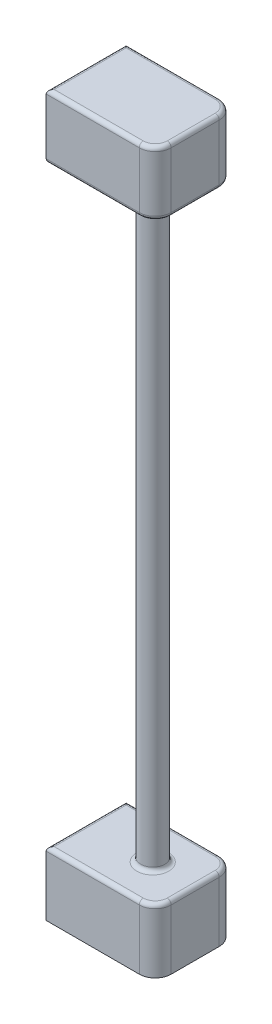
ISO-10303-21;
HEADER;
FILE_DESCRIPTION(('STEP AP214'),'2;1');
FILE_NAME('part.step','',(''),(''),'','','');
FILE_SCHEMA(('AUTOMOTIVE_DESIGN { 1 0 10303 214 1 1 1 1 }'));
ENDSEC;
DATA;
#1=APPLICATION_CONTEXT('core data for automotive mechanical design processes');
#2=APPLICATION_PROTOCOL_DEFINITION('international standard','automotive_design',2000,#1);
#3=PRODUCT_CONTEXT('',#1,'mechanical');
#4=PRODUCT('Part','Part','',(#3));
#5=PRODUCT_RELATED_PRODUCT_CATEGORY('part','',(#4));
#6=PRODUCT_DEFINITION_FORMATION('','',#4);
#7=PRODUCT_DEFINITION_CONTEXT('part definition',#1,'design');
#8=PRODUCT_DEFINITION('design','',#6,#7);
#9=PRODUCT_DEFINITION_SHAPE('','',#8);
#10=(LENGTH_UNIT() NAMED_UNIT(*) SI_UNIT(.MILLI.,.METRE.));
#11=(NAMED_UNIT(*) PLANE_ANGLE_UNIT() SI_UNIT($,.RADIAN.));
#12=(NAMED_UNIT(*) SI_UNIT($,.STERADIAN.) SOLID_ANGLE_UNIT());
#13=UNCERTAINTY_MEASURE_WITH_UNIT(LENGTH_MEASURE(1.E-05),#10,'distance_accuracy_value','');
#14=(GEOMETRIC_REPRESENTATION_CONTEXT(3) GLOBAL_UNCERTAINTY_ASSIGNED_CONTEXT((#13)) GLOBAL_UNIT_ASSIGNED_CONTEXT((#10,
#11,#12)) REPRESENTATION_CONTEXT('',''));
#15=CARTESIAN_POINT('',(0.,0.,0.));
#16=DIRECTION('',(0.,0.,1.));
#17=DIRECTION('',(1.,0.,0.));
#18=AXIS2_PLACEMENT_3D('',#15,#16,#17);
#19=CARTESIAN_POINT('',(0.,0.,0.));
#20=DIRECTION('',(0.,-1.,0.));
#21=DIRECTION('',(0.,0.,-1.));
#22=AXIS2_PLACEMENT_3D('',#19,#20,#21);
#23=CYLINDRICAL_SURFACE('',#22,7.5);
#24=CARTESIAN_POINT('',(0.,42.5,0.));
#25=DIRECTION('',(0.,-1.,0.));
#26=DIRECTION('',(0.,0.,-1.));
#27=AXIS2_PLACEMENT_3D('',#24,#25,#26);
#28=CIRCLE('',#27,7.5);
#29=CARTESIAN_POINT('',(0.,42.5,-7.5));
#30=VERTEX_POINT('',#29);
#31=EDGE_CURVE('E293',#30,#30,#28,.F.);
#32=ORIENTED_EDGE('',*,*,#31,.T.);
#33=EDGE_LOOP('',(#32));
#34=FACE_BOUND('',#33,.T.);
#35=CARTESIAN_POINT('',(0.,407.5,0.));
#36=DIRECTION('',(0.,1.,0.));
#37=DIRECTION('',(0.,0.,1.));
#38=AXIS2_PLACEMENT_3D('',#35,#36,#37);
#39=CIRCLE('',#38,7.5);
#40=CARTESIAN_POINT('',(0.,407.5,7.5));
#41=VERTEX_POINT('',#40);
#42=EDGE_CURVE('E277',#41,#41,#39,.F.);
#43=ORIENTED_EDGE('',*,*,#42,.T.);
#44=EDGE_LOOP('',(#43));
#45=FACE_BOUND('',#44,.T.);
#46=ADVANCED_FACE('F32',(#34,#45),#23,.T.);
#47=CARTESIAN_POINT('',(-41.6342119381749,410.,25.));
#48=DIRECTION('',(-1.,0.,0.));
#49=DIRECTION('',(0.,0.,1.));
#50=AXIS2_PLACEMENT_3D('',#47,#48,#49);
#51=PLANE('',#50);
#52=DIRECTION('',(0.,1.,0.));
#53=VECTOR('',#52,1.);
#54=CARTESIAN_POINT('',(-41.6342119381749,410.,-25.));
#55=LINE('',#54,#53);
#56=CARTESIAN_POINT('',(-41.6342119381749,412.5,-25.));
#57=VERTEX_POINT('',#56);
#58=CARTESIAN_POINT('',(-41.6342119381749,447.5,-25.));
#59=VERTEX_POINT('',#58);
#60=EDGE_CURVE('E220',#57,#59,#55,.T.);
#61=ORIENTED_EDGE('',*,*,#60,.F.);
#62=DIRECTION('',(0.,0.,1.));
#63=VECTOR('',#62,1.);
#64=CARTESIAN_POINT('',(-41.6342119381749,412.5,25.));
#65=LINE('',#64,#63);
#66=CARTESIAN_POINT('',(-41.6342119381749,412.5,25.));
#67=VERTEX_POINT('',#66);
#68=EDGE_CURVE('E271',#57,#67,#65,.T.);
#69=ORIENTED_EDGE('',*,*,#68,.T.);
#70=DIRECTION('',(0.,1.,0.));
#71=VECTOR('',#70,1.);
#72=CARTESIAN_POINT('',(-41.6342119381749,410.,25.));
#73=LINE('',#72,#71);
#74=CARTESIAN_POINT('',(-41.6342119381749,447.5,25.));
#75=VERTEX_POINT('',#74);
#76=EDGE_CURVE('E216',#67,#75,#73,.T.);
#77=ORIENTED_EDGE('',*,*,#76,.T.);
#78=DIRECTION('',(0.,0.,1.));
#79=VECTOR('',#78,1.);
#80=CARTESIAN_POINT('',(-41.6342119381749,447.5,25.));
#81=LINE('',#80,#79);
#82=EDGE_CURVE('E269',#75,#59,#81,.F.);
#83=ORIENTED_EDGE('',*,*,#82,.T.);
#84=EDGE_LOOP('',(#61,#69,#77,#83));
#85=FACE_BOUND('',#84,.T.);
#86=ADVANCED_FACE('F406',(#85),#51,.T.);
#87=CARTESIAN_POINT('',(-31.7477646685832,410.,-25.));
#88=DIRECTION('',(0.,0.,-1.));
#89=DIRECTION('',(-1.,0.,0.));
#90=AXIS2_PLACEMENT_3D('',#87,#88,#89);
#91=PLANE('',#90);
#92=DIRECTION('',(0.,1.,0.));
#93=VECTOR('',#92,1.);
#94=CARTESIAN_POINT('',(16.5523568564973,410.,-25.));
#95=LINE('',#94,#93);
#96=CARTESIAN_POINT('',(16.5523568564973,412.5,-25.));
#97=VERTEX_POINT('',#96);
#98=CARTESIAN_POINT('',(16.5523568564973,447.5,-25.));
#99=VERTEX_POINT('',#98);
#100=EDGE_CURVE('E223',#97,#99,#95,.T.);
#101=ORIENTED_EDGE('',*,*,#100,.F.);
#102=DIRECTION('',(-1.,0.,0.));
#103=VECTOR('',#102,1.);
#104=CARTESIAN_POINT('',(-41.6342119381749,412.5,-25.));
#105=LINE('',#104,#103);
#106=EDGE_CURVE('E267',#97,#57,#105,.T.);
#107=ORIENTED_EDGE('',*,*,#106,.T.);
#108=ORIENTED_EDGE('',*,*,#60,.T.);
#109=DIRECTION('',(-1.,0.,0.));
#110=VECTOR('',#109,1.);
#111=CARTESIAN_POINT('',(-31.7477646685832,447.5,-25.));
#112=LINE('',#111,#110);
#113=EDGE_CURVE('E264',#59,#99,#112,.F.);
#114=ORIENTED_EDGE('',*,*,#113,.T.);
#115=EDGE_LOOP('',(#101,#107,#108,#114));
#116=FACE_BOUND('',#115,.T.);
#117=ADVANCED_FACE('F412',(#116),#91,.T.);
#118=CARTESIAN_POINT('',(16.5523568564973,410.,-15.));
#119=DIRECTION('',(0.,1.,0.));
#120=DIRECTION('',(0.,0.,1.));
#121=AXIS2_PLACEMENT_3D('',#118,#119,#120);
#122=CYLINDRICAL_SURFACE('',#121,10.);
#123=DIRECTION('',(0.,1.,0.));
#124=VECTOR('',#123,1.);
#125=CARTESIAN_POINT('',(26.5523568564973,410.,-14.9999999999999));
#126=LINE('',#125,#124);
#127=CARTESIAN_POINT('',(26.5523568564973,412.5,-14.9999999999999));
#128=VERTEX_POINT('',#127);
#129=CARTESIAN_POINT('',(26.5523568564973,447.5,-14.9999999999999));
#130=VERTEX_POINT('',#129);
#131=EDGE_CURVE('E226',#128,#130,#126,.T.);
#132=ORIENTED_EDGE('',*,*,#131,.F.);
#133=CARTESIAN_POINT('',(16.5523568564973,412.5,-15.));
#134=DIRECTION('',(0.,1.,0.));
#135=DIRECTION('',(0.,0.,1.));
#136=AXIS2_PLACEMENT_3D('',#133,#134,#135);
#137=CIRCLE('',#136,10.);
#138=EDGE_CURVE('E262',#128,#97,#137,.T.);
#139=ORIENTED_EDGE('',*,*,#138,.T.);
#140=ORIENTED_EDGE('',*,*,#100,.T.);
#141=CARTESIAN_POINT('',(16.5523568564973,447.5,-15.));
#142=DIRECTION('',(0.,1.,0.));
#143=DIRECTION('',(0.,0.,1.));
#144=AXIS2_PLACEMENT_3D('',#141,#142,#143);
#145=CIRCLE('',#144,10.);
#146=EDGE_CURVE('E260',#99,#130,#145,.F.);
#147=ORIENTED_EDGE('',*,*,#146,.T.);
#148=EDGE_LOOP('',(#132,#139,#140,#147));
#149=FACE_BOUND('',#148,.T.);
#150=ADVANCED_FACE('F681',(#149),#122,.T.);
#151=CARTESIAN_POINT('',(26.5523568564973,410.,-14.9999999999999));
#152=DIRECTION('',(1.,0.,0.));
#153=DIRECTION('',(0.,0.,-1.));
#154=AXIS2_PLACEMENT_3D('',#151,#152,#153);
#155=PLANE('',#154);
#156=DIRECTION('',(0.,1.,0.));
#157=VECTOR('',#156,1.);
#158=CARTESIAN_POINT('',(26.5523568564973,410.,14.9999999999999));
#159=LINE('',#158,#157);
#160=CARTESIAN_POINT('',(26.5523568564973,412.5,14.9999999999999));
#161=VERTEX_POINT('',#160);
#162=CARTESIAN_POINT('',(26.5523568564973,447.5,14.9999999999999));
#163=VERTEX_POINT('',#162);
#164=EDGE_CURVE('E229',#161,#163,#159,.T.);
#165=ORIENTED_EDGE('',*,*,#164,.F.);
#166=DIRECTION('',(0.,0.,-1.));
#167=VECTOR('',#166,1.);
#168=CARTESIAN_POINT('',(26.5523568564973,412.5,-14.9999999999999));
#169=LINE('',#168,#167);
#170=EDGE_CURVE('E258',#161,#128,#169,.T.);
#171=ORIENTED_EDGE('',*,*,#170,.T.);
#172=ORIENTED_EDGE('',*,*,#131,.T.);
#173=DIRECTION('',(0.,0.,-1.));
#174=VECTOR('',#173,1.);
#175=CARTESIAN_POINT('',(26.5523568564973,447.5,-14.9999999999999));
#176=LINE('',#175,#174);
#177=EDGE_CURVE('E256',#130,#163,#176,.F.);
#178=ORIENTED_EDGE('',*,*,#177,.T.);
#179=EDGE_LOOP('',(#165,#171,#172,#178));
#180=FACE_BOUND('',#179,.T.);
#181=ADVANCED_FACE('F671',(#180),#155,.T.);
#182=CARTESIAN_POINT('',(16.5523568564973,410.,15.));
#183=DIRECTION('',(0.,1.,0.));
#184=DIRECTION('',(0.,0.,1.));
#185=AXIS2_PLACEMENT_3D('',#182,#183,#184);
#186=CYLINDRICAL_SURFACE('',#185,10.);
#187=DIRECTION('',(0.,1.,0.));
#188=VECTOR('',#187,1.);
#189=CARTESIAN_POINT('',(16.5523568564973,410.,25.));
#190=LINE('',#189,#188);
#191=CARTESIAN_POINT('',(16.5523568564973,412.5,25.));
#192=VERTEX_POINT('',#191);
#193=CARTESIAN_POINT('',(16.5523568564973,447.5,25.));
#194=VERTEX_POINT('',#193);
#195=EDGE_CURVE('E232',#192,#194,#190,.T.);
#196=ORIENTED_EDGE('',*,*,#195,.F.);
#197=CARTESIAN_POINT('',(16.5523568564973,412.5,15.));
#198=DIRECTION('',(0.,1.,0.));
#199=DIRECTION('',(0.,0.,1.));
#200=AXIS2_PLACEMENT_3D('',#197,#198,#199);
#201=CIRCLE('',#200,10.);
#202=EDGE_CURVE('E237',#192,#161,#201,.T.);
#203=ORIENTED_EDGE('',*,*,#202,.T.);
#204=ORIENTED_EDGE('',*,*,#164,.T.);
#205=CARTESIAN_POINT('',(16.5523568564973,447.5,15.));
#206=DIRECTION('',(0.,1.,0.));
#207=DIRECTION('',(0.,0.,1.));
#208=AXIS2_PLACEMENT_3D('',#205,#206,#207);
#209=CIRCLE('',#208,10.);
#210=EDGE_CURVE('E219',#163,#194,#209,.F.);
#211=ORIENTED_EDGE('',*,*,#210,.T.);
#212=EDGE_LOOP('',(#196,#203,#204,#211));
#213=FACE_BOUND('',#212,.T.);
#214=ADVANCED_FACE('F661',(#213),#186,.T.);
#215=CARTESIAN_POINT('',(-31.7477646685832,410.,25.));
#216=DIRECTION('',(0.,0.,1.));
#217=DIRECTION('',(1.,0.,0.));
#218=AXIS2_PLACEMENT_3D('',#215,#216,#217);
#219=PLANE('',#218);
#220=ORIENTED_EDGE('',*,*,#76,.F.);
#221=DIRECTION('',(1.,0.,0.));
#222=VECTOR('',#221,1.);
#223=CARTESIAN_POINT('',(16.5523568564973,412.5,25.));
#224=LINE('',#223,#222);
#225=EDGE_CURVE('E275',#67,#192,#224,.T.);
#226=ORIENTED_EDGE('',*,*,#225,.T.);
#227=ORIENTED_EDGE('',*,*,#195,.T.);
#228=DIRECTION('',(1.,0.,0.));
#229=VECTOR('',#228,1.);
#230=CARTESIAN_POINT('',(-31.7477646685832,447.5,25.));
#231=LINE('',#230,#229);
#232=EDGE_CURVE('E273',#194,#75,#231,.F.);
#233=ORIENTED_EDGE('',*,*,#232,.T.);
#234=EDGE_LOOP('',(#220,#226,#227,#233));
#235=FACE_BOUND('',#234,.T.);
#236=ADVANCED_FACE('F651',(#235),#219,.T.);
#237=CARTESIAN_POINT('',(16.5523568564973,410.,-15.));
#238=DIRECTION('',(0.,1.,0.));
#239=DIRECTION('',(0.,0.,1.));
#240=AXIS2_PLACEMENT_3D('',#237,#238,#239);
#241=PLANE('',#240);
#242=DIRECTION('',(0.,0.,-1.));
#243=VECTOR('',#242,1.);
#244=CARTESIAN_POINT('',(24.0523568564973,410.,14.9999999999999));
#245=LINE('',#244,#243);
#246=CARTESIAN_POINT('',(24.0523568564973,410.,-14.9999999999999));
#247=VERTEX_POINT('',#246);
#248=CARTESIAN_POINT('',(24.0523568564973,410.,14.9999999999999));
#249=VERTEX_POINT('',#248);
#250=EDGE_CURVE('E251',#247,#249,#245,.F.);
#251=ORIENTED_EDGE('',*,*,#250,.T.);
#252=CARTESIAN_POINT('',(16.5523568564973,410.,15.));
#253=DIRECTION('',(0.,1.,0.));
#254=DIRECTION('',(0.,0.,1.));
#255=AXIS2_PLACEMENT_3D('',#252,#253,#254);
#256=CIRCLE('',#255,7.5);
#257=CARTESIAN_POINT('',(16.5523568564973,410.,22.5));
#258=VERTEX_POINT('',#257);
#259=EDGE_CURVE('E253',#249,#258,#256,.F.);
#260=ORIENTED_EDGE('',*,*,#259,.T.);
#261=DIRECTION('',(1.,0.,0.));
#262=VECTOR('',#261,1.);
#263=CARTESIAN_POINT('',(-41.6342119381749,410.,22.5));
#264=LINE('',#263,#262);
#265=CARTESIAN_POINT('',(-39.1342119381748,410.,22.5));
#266=VERTEX_POINT('',#265);
#267=EDGE_CURVE('E243',#258,#266,#264,.F.);
#268=ORIENTED_EDGE('',*,*,#267,.T.);
#269=DIRECTION('',(0.,0.,1.));
#270=VECTOR('',#269,1.);
#271=CARTESIAN_POINT('',(-39.1342119381748,410.,-25.));
#272=LINE('',#271,#270);
#273=CARTESIAN_POINT('',(-39.1342119381748,410.,-22.5));
#274=VERTEX_POINT('',#273);
#275=EDGE_CURVE('E245',#266,#274,#272,.F.);
#276=ORIENTED_EDGE('',*,*,#275,.T.);
#277=DIRECTION('',(-1.,0.,0.));
#278=VECTOR('',#277,1.);
#279=CARTESIAN_POINT('',(16.5523568564973,410.,-22.5));
#280=LINE('',#279,#278);
#281=CARTESIAN_POINT('',(16.5523568564973,410.,-22.5));
#282=VERTEX_POINT('',#281);
#283=EDGE_CURVE('E247',#274,#282,#280,.F.);
#284=ORIENTED_EDGE('',*,*,#283,.T.);
#285=CARTESIAN_POINT('',(16.5523568564973,410.,-15.));
#286=DIRECTION('',(0.,1.,0.));
#287=DIRECTION('',(0.,0.,1.));
#288=AXIS2_PLACEMENT_3D('',#285,#286,#287);
#289=CIRCLE('',#288,7.5);
#290=EDGE_CURVE('E249',#282,#247,#289,.F.);
#291=ORIENTED_EDGE('',*,*,#290,.T.);
#292=EDGE_LOOP('',(#251,#260,#268,#276,#284,#291));
#293=FACE_BOUND('',#292,.T.);
#294=CARTESIAN_POINT('',(0.,410.,0.));
#295=DIRECTION('',(0.,1.,0.));
#296=DIRECTION('',(0.,0.,1.));
#297=AXIS2_PLACEMENT_3D('',#294,#295,#296);
#298=CIRCLE('',#297,10.);
#299=CARTESIAN_POINT('',(0.,410.,10.));
#300=VERTEX_POINT('',#299);
#301=EDGE_CURVE('E240',#300,#300,#298,.T.);
#302=ORIENTED_EDGE('',*,*,#301,.T.);
#303=EDGE_LOOP('',(#302));
#304=FACE_BOUND('',#303,.T.);
#305=ADVANCED_FACE('F641',(#293,#304),#241,.F.);
#306=CARTESIAN_POINT('',(7.5,450.,0.));
#307=DIRECTION('',(0.,1.,0.));
#308=DIRECTION('',(0.,0.,1.));
#309=AXIS2_PLACEMENT_3D('',#306,#307,#308);
#310=PLANE('',#309);
#311=CARTESIAN_POINT('',(16.5523568564973,450.,-15.));
#312=DIRECTION('',(0.,1.,0.));
#313=DIRECTION('',(0.,0.,1.));
#314=AXIS2_PLACEMENT_3D('',#311,#312,#313);
#315=CIRCLE('',#314,7.5);
#316=CARTESIAN_POINT('',(24.0523568564973,450.,-15.));
#317=VERTEX_POINT('',#316);
#318=CARTESIAN_POINT('',(16.5523568564973,450.,-22.5));
#319=VERTEX_POINT('',#318);
#320=EDGE_CURVE('E288',#317,#319,#315,.T.);
#321=ORIENTED_EDGE('',*,*,#320,.T.);
#322=DIRECTION('',(-1.,0.,0.));
#323=VECTOR('',#322,1.);
#324=CARTESIAN_POINT('',(7.5,450.,-22.5));
#325=LINE('',#324,#323);
#326=CARTESIAN_POINT('',(-39.1342119381748,450.,-22.5));
#327=VERTEX_POINT('',#326);
#328=EDGE_CURVE('E290',#319,#327,#325,.T.);
#329=ORIENTED_EDGE('',*,*,#328,.T.);
#330=DIRECTION('',(0.,0.,1.));
#331=VECTOR('',#330,1.);
#332=CARTESIAN_POINT('',(-39.1342119381748,450.,0.));
#333=LINE('',#332,#331);
#334=CARTESIAN_POINT('',(-39.1342119381748,450.,22.5));
#335=VERTEX_POINT('',#334);
#336=EDGE_CURVE('E280',#327,#335,#333,.T.);
#337=ORIENTED_EDGE('',*,*,#336,.T.);
#338=DIRECTION('',(1.,0.,0.));
#339=VECTOR('',#338,1.);
#340=CARTESIAN_POINT('',(7.5,450.,22.5));
#341=LINE('',#340,#339);
#342=CARTESIAN_POINT('',(16.5523568564973,450.,22.5));
#343=VERTEX_POINT('',#342);
#344=EDGE_CURVE('E282',#335,#343,#341,.T.);
#345=ORIENTED_EDGE('',*,*,#344,.T.);
#346=CARTESIAN_POINT('',(16.5523568564973,450.,15.));
#347=DIRECTION('',(0.,1.,0.));
#348=DIRECTION('',(0.,0.,1.));
#349=AXIS2_PLACEMENT_3D('',#346,#347,#348);
#350=CIRCLE('',#349,7.5);
#351=CARTESIAN_POINT('',(24.0523568564973,450.,14.9999999999999));
#352=VERTEX_POINT('',#351);
#353=EDGE_CURVE('E284',#343,#352,#350,.T.);
#354=ORIENTED_EDGE('',*,*,#353,.T.);
#355=DIRECTION('',(0.,0.,-1.));
#356=VECTOR('',#355,1.);
#357=CARTESIAN_POINT('',(24.0523568564973,450.,0.));
#358=LINE('',#357,#356);
#359=EDGE_CURVE('E286',#352,#317,#358,.T.);
#360=ORIENTED_EDGE('',*,*,#359,.T.);
#361=EDGE_LOOP('',(#321,#329,#337,#345,#354,#360));
#362=FACE_BOUND('',#361,.T.);
#363=ADVANCED_FACE('F418',(#362),#310,.T.);
#364=CARTESIAN_POINT('',(-31.7477646685832,412.5,-22.5));
#365=DIRECTION('',(1.,0.,0.));
#366=DIRECTION('',(0.,0.,-1.));
#367=AXIS2_PLACEMENT_3D('',#364,#365,#366);
#368=CYLINDRICAL_SURFACE('',#367,2.5);
#369=CARTESIAN_POINT('',(16.5523568564973,412.5,-22.5));
#370=DIRECTION('',(1.,0.,0.));
#371=DIRECTION('',(0.,0.,-1.));
#372=AXIS2_PLACEMENT_3D('',#369,#370,#371);
#373=CIRCLE('',#372,2.5);
#374=EDGE_CURVE('E305',#282,#97,#373,.T.);
#375=ORIENTED_EDGE('',*,*,#374,.F.);
#376=ORIENTED_EDGE('',*,*,#283,.F.);
#377=CARTESIAN_POINT('',(-39.1342119381748,412.5,-22.5));
#378=DIRECTION('',(0.707106781186547,0.,-0.707106781186547));
#379=DIRECTION('',(-0.707106781186547,0.,-0.707106781186547));
#380=AXIS2_PLACEMENT_3D('',#377,#378,#379);
#381=ELLIPSE('',#380,3.53553390593274,2.5);
#382=EDGE_CURVE('E235',#57,#274,#381,.F.);
#383=ORIENTED_EDGE('',*,*,#382,.F.);
#384=ORIENTED_EDGE('',*,*,#106,.F.);
#385=EDGE_LOOP('',(#375,#376,#383,#384));
#386=FACE_BOUND('',#385,.T.);
#387=ADVANCED_FACE('F443',(#386),#368,.T.);
#388=CARTESIAN_POINT('',(-39.1342119381748,412.5,25.));
#389=DIRECTION('',(0.,0.,-1.));
#390=DIRECTION('',(-1.,0.,0.));
#391=AXIS2_PLACEMENT_3D('',#388,#389,#390);
#392=CYLINDRICAL_SURFACE('',#391,2.5);
#393=ORIENTED_EDGE('',*,*,#382,.T.);
#394=ORIENTED_EDGE('',*,*,#275,.F.);
#395=CARTESIAN_POINT('',(-39.1342119381748,412.5,22.5));
#396=DIRECTION('',(-0.707106781186547,0.,-0.707106781186547));
#397=DIRECTION('',(-0.707106781186548,0.,0.707106781186547));
#398=AXIS2_PLACEMENT_3D('',#395,#396,#397);
#399=ELLIPSE('',#398,3.53553390593274,2.5);
#400=EDGE_CURVE('E302',#67,#266,#399,.F.);
#401=ORIENTED_EDGE('',*,*,#400,.F.);
#402=ORIENTED_EDGE('',*,*,#68,.F.);
#403=EDGE_LOOP('',(#393,#394,#401,#402));
#404=FACE_BOUND('',#403,.T.);
#405=ADVANCED_FACE('F439',(#404),#392,.T.);
#406=CARTESIAN_POINT('',(16.5523568564973,412.5,-15.));
#407=DIRECTION('',(0.,1.,0.));
#408=DIRECTION('',(0.,0.,1.));
#409=AXIS2_PLACEMENT_3D('',#406,#407,#408);
#410=TOROIDAL_SURFACE('',#409,7.5,2.5);
#411=ORIENTED_EDGE('',*,*,#374,.T.);
#412=ORIENTED_EDGE('',*,*,#138,.F.);
#413=CARTESIAN_POINT('',(24.0523568564973,412.5,-14.9999999999999));
#414=DIRECTION('',(0.,0.,1.));
#415=DIRECTION('',(1.,0.,0.));
#416=AXIS2_PLACEMENT_3D('',#413,#414,#415);
#417=CIRCLE('',#416,2.5);
#418=EDGE_CURVE('E299',#247,#128,#417,.T.);
#419=ORIENTED_EDGE('',*,*,#418,.F.);
#420=ORIENTED_EDGE('',*,*,#290,.F.);
#421=EDGE_LOOP('',(#411,#412,#419,#420));
#422=FACE_BOUND('',#421,.T.);
#423=ADVANCED_FACE('F435',(#422),#410,.T.);
#424=CARTESIAN_POINT('',(-31.7477646685832,412.5,22.5));
#425=DIRECTION('',(-1.,0.,0.));
#426=DIRECTION('',(0.,0.,1.));
#427=AXIS2_PLACEMENT_3D('',#424,#425,#426);
#428=CYLINDRICAL_SURFACE('',#427,2.5);
#429=ORIENTED_EDGE('',*,*,#400,.T.);
#430=ORIENTED_EDGE('',*,*,#267,.F.);
#431=CARTESIAN_POINT('',(16.5523568564973,412.5,22.5));
#432=DIRECTION('',(1.,0.,0.));
#433=DIRECTION('',(0.,1.,0.));
#434=AXIS2_PLACEMENT_3D('',#431,#432,#433);
#435=CIRCLE('',#434,2.5);
#436=EDGE_CURVE('E296',#192,#258,#435,.T.);
#437=ORIENTED_EDGE('',*,*,#436,.F.);
#438=ORIENTED_EDGE('',*,*,#225,.F.);
#439=EDGE_LOOP('',(#429,#430,#437,#438));
#440=FACE_BOUND('',#439,.T.);
#441=ADVANCED_FACE('F431',(#440),#428,.T.);
#442=CARTESIAN_POINT('',(24.0523568564973,412.5,-14.9999999999999));
#443=DIRECTION('',(0.,0.,1.));
#444=DIRECTION('',(1.,0.,0.));
#445=AXIS2_PLACEMENT_3D('',#442,#443,#444);
#446=CYLINDRICAL_SURFACE('',#445,2.5);
#447=ORIENTED_EDGE('',*,*,#418,.T.);
#448=ORIENTED_EDGE('',*,*,#170,.F.);
#449=CARTESIAN_POINT('',(24.0523568564973,412.5,14.9999999999999));
#450=DIRECTION('',(0.,0.,1.));
#451=DIRECTION('',(1.,0.,0.));
#452=AXIS2_PLACEMENT_3D('',#449,#450,#451);
#453=CIRCLE('',#452,2.5);
#454=EDGE_CURVE('E294',#249,#161,#453,.T.);
#455=ORIENTED_EDGE('',*,*,#454,.F.);
#456=ORIENTED_EDGE('',*,*,#250,.F.);
#457=EDGE_LOOP('',(#447,#448,#455,#456));
#458=FACE_BOUND('',#457,.T.);
#459=ADVANCED_FACE('F427',(#458),#446,.T.);
#460=CARTESIAN_POINT('',(16.5523568564973,412.5,15.));
#461=DIRECTION('',(0.,1.,0.));
#462=DIRECTION('',(0.,0.,1.));
#463=AXIS2_PLACEMENT_3D('',#460,#461,#462);
#464=TOROIDAL_SURFACE('',#463,7.5,2.5);
#465=ORIENTED_EDGE('',*,*,#436,.T.);
#466=ORIENTED_EDGE('',*,*,#259,.F.);
#467=ORIENTED_EDGE('',*,*,#454,.T.);
#468=ORIENTED_EDGE('',*,*,#202,.F.);
#469=EDGE_LOOP('',(#465,#466,#467,#468));
#470=FACE_BOUND('',#469,.T.);
#471=ADVANCED_FACE('F423',(#470),#464,.T.);
#472=CARTESIAN_POINT('',(0.,407.5,0.));
#473=DIRECTION('',(0.,1.,0.));
#474=DIRECTION('',(0.,0.,1.));
#475=AXIS2_PLACEMENT_3D('',#472,#473,#474);
#476=TOROIDAL_SURFACE('',#475,10.,2.5);
#477=ORIENTED_EDGE('',*,*,#42,.F.);
#478=EDGE_LOOP('',(#477));
#479=FACE_BOUND('',#478,.T.);
#480=ORIENTED_EDGE('',*,*,#301,.F.);
#481=EDGE_LOOP('',(#480));
#482=FACE_BOUND('',#481,.T.);
#483=ADVANCED_FACE('F426',(#479,#482),#476,.F.);
#484=CARTESIAN_POINT('',(16.5523568564973,447.5,15.));
#485=DIRECTION('',(0.,1.,0.));
#486=DIRECTION('',(0.,0.,1.));
#487=AXIS2_PLACEMENT_3D('',#484,#485,#486);
#488=TOROIDAL_SURFACE('',#487,7.5,2.5);
#489=CARTESIAN_POINT('',(16.5523568564973,447.5,22.5));
#490=DIRECTION('',(-1.,0.,0.));
#491=DIRECTION('',(0.,0.,1.));
#492=AXIS2_PLACEMENT_3D('',#489,#490,#491);
#493=CIRCLE('',#492,2.5);
#494=EDGE_CURVE('E319',#194,#343,#493,.T.);
#495=ORIENTED_EDGE('',*,*,#494,.F.);
#496=ORIENTED_EDGE('',*,*,#210,.F.);
#497=CARTESIAN_POINT('',(24.0523568564973,447.5,14.9999999999999));
#498=DIRECTION('',(0.,0.,-1.));
#499=DIRECTION('',(-1.,0.,0.));
#500=AXIS2_PLACEMENT_3D('',#497,#498,#499);
#501=CIRCLE('',#500,2.5);
#502=EDGE_CURVE('E297',#352,#163,#501,.T.);
#503=ORIENTED_EDGE('',*,*,#502,.F.);
#504=ORIENTED_EDGE('',*,*,#353,.F.);
#505=EDGE_LOOP('',(#495,#496,#503,#504));
#506=FACE_BOUND('',#505,.T.);
#507=ADVANCED_FACE('F450',(#506),#488,.T.);
#508=CARTESIAN_POINT('',(24.0523568564973,447.5,0.));
#509=DIRECTION('',(0.,0.,-1.));
#510=DIRECTION('',(-1.,0.,0.));
#511=AXIS2_PLACEMENT_3D('',#508,#509,#510);
#512=CYLINDRICAL_SURFACE('',#511,2.5);
#513=ORIENTED_EDGE('',*,*,#502,.T.);
#514=ORIENTED_EDGE('',*,*,#177,.F.);
#515=CARTESIAN_POINT('',(24.0523568564973,447.5,-15.));
#516=DIRECTION('',(0.,0.,-1.));
#517=DIRECTION('',(-1.,0.,0.));
#518=AXIS2_PLACEMENT_3D('',#515,#516,#517);
#519=CIRCLE('',#518,2.5);
#520=EDGE_CURVE('E316',#317,#130,#519,.T.);
#521=ORIENTED_EDGE('',*,*,#520,.F.);
#522=ORIENTED_EDGE('',*,*,#359,.F.);
#523=EDGE_LOOP('',(#513,#514,#521,#522));
#524=FACE_BOUND('',#523,.T.);
#525=ADVANCED_FACE('F468',(#524),#512,.T.);
#526=CARTESIAN_POINT('',(7.5,447.5,22.5));
#527=DIRECTION('',(1.,0.,0.));
#528=DIRECTION('',(0.,0.,-1.));
#529=AXIS2_PLACEMENT_3D('',#526,#527,#528);
#530=CYLINDRICAL_SURFACE('',#529,2.5);
#531=ORIENTED_EDGE('',*,*,#494,.T.);
#532=ORIENTED_EDGE('',*,*,#344,.F.);
#533=CARTESIAN_POINT('',(-39.1342119381748,447.5,22.5));
#534=DIRECTION('',(0.707106781186547,0.,0.707106781186547));
#535=DIRECTION('',(-0.707106781186548,0.,0.707106781186547));
#536=AXIS2_PLACEMENT_3D('',#533,#534,#535);
#537=ELLIPSE('',#536,3.53553390593274,2.5);
#538=EDGE_CURVE('E313',#75,#335,#537,.F.);
#539=ORIENTED_EDGE('',*,*,#538,.F.);
#540=ORIENTED_EDGE('',*,*,#232,.F.);
#541=EDGE_LOOP('',(#531,#532,#539,#540));
#542=FACE_BOUND('',#541,.T.);
#543=ADVANCED_FACE('F464',(#542),#530,.T.);
#544=CARTESIAN_POINT('',(16.5523568564973,447.5,-15.));
#545=DIRECTION('',(0.,1.,0.));
#546=DIRECTION('',(0.,0.,1.));
#547=AXIS2_PLACEMENT_3D('',#544,#545,#546);
#548=TOROIDAL_SURFACE('',#547,7.5,2.5);
#549=ORIENTED_EDGE('',*,*,#520,.T.);
#550=ORIENTED_EDGE('',*,*,#146,.F.);
#551=CARTESIAN_POINT('',(16.5523568564973,447.5,-22.5));
#552=DIRECTION('',(-1.,0.,0.));
#553=DIRECTION('',(0.,0.,1.));
#554=AXIS2_PLACEMENT_3D('',#551,#552,#553);
#555=CIRCLE('',#554,2.5);
#556=EDGE_CURVE('E311',#319,#99,#555,.T.);
#557=ORIENTED_EDGE('',*,*,#556,.F.);
#558=ORIENTED_EDGE('',*,*,#320,.F.);
#559=EDGE_LOOP('',(#549,#550,#557,#558));
#560=FACE_BOUND('',#559,.T.);
#561=ADVANCED_FACE('F460',(#560),#548,.T.);
#562=CARTESIAN_POINT('',(-39.1342119381748,447.5,0.));
#563=DIRECTION('',(0.,0.,1.));
#564=DIRECTION('',(1.,0.,0.));
#565=AXIS2_PLACEMENT_3D('',#562,#563,#564);
#566=CYLINDRICAL_SURFACE('',#565,2.5);
#567=ORIENTED_EDGE('',*,*,#538,.T.);
#568=ORIENTED_EDGE('',*,*,#336,.F.);
#569=CARTESIAN_POINT('',(-39.1342119381748,447.5,-22.5));
#570=DIRECTION('',(-0.707106781186547,0.,0.707106781186547));
#571=DIRECTION('',(0.707106781186547,0.,0.707106781186547));
#572=AXIS2_PLACEMENT_3D('',#569,#570,#571);
#573=ELLIPSE('',#572,3.53553390593274,2.5);
#574=EDGE_CURVE('E208',#59,#327,#573,.F.);
#575=ORIENTED_EDGE('',*,*,#574,.F.);
#576=ORIENTED_EDGE('',*,*,#82,.F.);
#577=EDGE_LOOP('',(#567,#568,#575,#576));
#578=FACE_BOUND('',#577,.T.);
#579=ADVANCED_FACE('F456',(#578),#566,.T.);
#580=CARTESIAN_POINT('',(7.5,447.5,-22.5));
#581=DIRECTION('',(-1.,0.,0.));
#582=DIRECTION('',(0.,0.,1.));
#583=AXIS2_PLACEMENT_3D('',#580,#581,#582);
#584=CYLINDRICAL_SURFACE('',#583,2.5);
#585=ORIENTED_EDGE('',*,*,#556,.T.);
#586=ORIENTED_EDGE('',*,*,#113,.F.);
#587=ORIENTED_EDGE('',*,*,#574,.T.);
#588=ORIENTED_EDGE('',*,*,#328,.F.);
#589=EDGE_LOOP('',(#585,#586,#587,#588));
#590=FACE_BOUND('',#589,.T.);
#591=ADVANCED_FACE('F452',(#590),#584,.T.);
#592=CARTESIAN_POINT('',(16.5523568564973,40.,-15.));
#593=DIRECTION('',(0.,-1.,0.));
#594=DIRECTION('',(0.,0.,1.));
#595=AXIS2_PLACEMENT_3D('',#592,#593,#594);
#596=PLANE('',#595);
#597=CARTESIAN_POINT('',(0.,40.,0.));
#598=DIRECTION('',(0.,-1.,0.));
#599=DIRECTION('',(0.,0.,-1.));
#600=AXIS2_PLACEMENT_3D('',#597,#598,#599);
#601=CIRCLE('',#600,10.);
#602=CARTESIAN_POINT('',(0.,40.,-10.));
#603=VERTEX_POINT('',#602);
#604=EDGE_CURVE('E339',#603,#603,#601,.T.);
#605=ORIENTED_EDGE('',*,*,#604,.T.);
#606=EDGE_LOOP('',(#605));
#607=FACE_BOUND('',#606,.T.);
#608=DIRECTION('',(-1.,0.,0.));
#609=VECTOR('',#608,1.);
#610=CARTESIAN_POINT('',(16.5523568564973,40.,-22.5));
#611=LINE('',#610,#609);
#612=CARTESIAN_POINT('',(16.5523568564973,40.,-22.5));
#613=VERTEX_POINT('',#612);
#614=CARTESIAN_POINT('',(-39.1342119381748,40.,-22.5));
#615=VERTEX_POINT('',#614);
#616=EDGE_CURVE('E334',#613,#615,#611,.T.);
#617=ORIENTED_EDGE('',*,*,#616,.T.);
#618=DIRECTION('',(0.,0.,1.));
#619=VECTOR('',#618,1.);
#620=CARTESIAN_POINT('',(-39.1342119381748,40.,-15.));
#621=LINE('',#620,#619);
#622=CARTESIAN_POINT('',(-39.1342119381748,40.,22.5));
#623=VERTEX_POINT('',#622);
#624=EDGE_CURVE('E336',#615,#623,#621,.T.);
#625=ORIENTED_EDGE('',*,*,#624,.T.);
#626=DIRECTION('',(1.,0.,0.));
#627=VECTOR('',#626,1.);
#628=CARTESIAN_POINT('',(16.5523568564973,40.,22.5));
#629=LINE('',#628,#627);
#630=CARTESIAN_POINT('',(16.5523568564973,40.,22.5));
#631=VERTEX_POINT('',#630);
#632=EDGE_CURVE('E326',#623,#631,#629,.T.);
#633=ORIENTED_EDGE('',*,*,#632,.T.);
#634=CARTESIAN_POINT('',(16.5523568564973,40.,15.));
#635=DIRECTION('',(0.,-1.,0.));
#636=DIRECTION('',(0.,0.,-1.));
#637=AXIS2_PLACEMENT_3D('',#634,#635,#636);
#638=CIRCLE('',#637,7.5);
#639=CARTESIAN_POINT('',(24.0523568564973,40.,14.9999999999999));
#640=VERTEX_POINT('',#639);
#641=EDGE_CURVE('E328',#631,#640,#638,.F.);
#642=ORIENTED_EDGE('',*,*,#641,.T.);
#643=DIRECTION('',(0.,0.,-1.));
#644=VECTOR('',#643,1.);
#645=CARTESIAN_POINT('',(24.0523568564973,40.,-15.));
#646=LINE('',#645,#644);
#647=CARTESIAN_POINT('',(24.0523568564973,40.,-15.));
#648=VERTEX_POINT('',#647);
#649=EDGE_CURVE('E330',#640,#648,#646,.T.);
#650=ORIENTED_EDGE('',*,*,#649,.T.);
#651=CARTESIAN_POINT('',(16.5523568564973,40.,-15.));
#652=DIRECTION('',(0.,-1.,0.));
#653=DIRECTION('',(0.,0.,-1.));
#654=AXIS2_PLACEMENT_3D('',#651,#652,#653);
#655=CIRCLE('',#654,7.5);
#656=EDGE_CURVE('E332',#648,#613,#655,.F.);
#657=ORIENTED_EDGE('',*,*,#656,.T.);
#658=EDGE_LOOP('',(#617,#625,#633,#642,#650,#657));
#659=FACE_BOUND('',#658,.T.);
#660=ADVANCED_FACE('F455',(#607,#659),#596,.F.);
#661=CARTESIAN_POINT('',(-31.7477646685832,40.,25.));
#662=DIRECTION('',(0.,0.,-1.));
#663=DIRECTION('',(-1.,0.,0.));
#664=AXIS2_PLACEMENT_3D('',#661,#662,#663);
#665=PLANE('',#664);
#666=DIRECTION('',(0.,-1.,0.));
#667=VECTOR('',#666,1.);
#668=CARTESIAN_POINT('',(16.5523568564973,40.,25.));
#669=LINE('',#668,#667);
#670=CARTESIAN_POINT('',(16.5523568564973,37.5,25.));
#671=VERTEX_POINT('',#670);
#672=CARTESIAN_POINT('',(16.5523568564973,0.,25.));
#673=VERTEX_POINT('',#672);
#674=EDGE_CURVE('E206',#671,#673,#669,.T.);
#675=ORIENTED_EDGE('',*,*,#674,.F.);
#676=DIRECTION('',(1.,0.,0.));
#677=VECTOR('',#676,1.);
#678=CARTESIAN_POINT('',(-31.7477646685832,37.5,25.));
#679=LINE('',#678,#677);
#680=CARTESIAN_POINT('',(-41.6342119381749,37.5,25.));
#681=VERTEX_POINT('',#680);
#682=EDGE_CURVE('E11',#671,#681,#679,.F.);
#683=ORIENTED_EDGE('',*,*,#682,.T.);
#684=DIRECTION('',(0.,-1.,0.));
#685=VECTOR('',#684,1.);
#686=CARTESIAN_POINT('',(-41.6342119381749,40.,25.));
#687=LINE('',#686,#685);
#688=CARTESIAN_POINT('',(-41.6342119381749,0.,25.));
#689=VERTEX_POINT('',#688);
#690=EDGE_CURVE('E176',#681,#689,#687,.T.);
#691=ORIENTED_EDGE('',*,*,#690,.T.);
#692=DIRECTION('',(1.,0.,0.));
#693=VECTOR('',#692,1.);
#694=CARTESIAN_POINT('',(-31.7477646685832,0.,25.));
#695=LINE('',#694,#693);
#696=EDGE_CURVE('E180',#689,#673,#695,.T.);
#697=ORIENTED_EDGE('',*,*,#696,.T.);
#698=EDGE_LOOP('',(#675,#683,#691,#697));
#699=FACE_BOUND('',#698,.T.);
#700=ADVANCED_FACE('F178',(#699),#665,.F.);
#701=CARTESIAN_POINT('',(16.5523568564973,40.,15.));
#702=DIRECTION('',(0.,-1.,0.));
#703=DIRECTION('',(0.,0.,-1.));
#704=AXIS2_PLACEMENT_3D('',#701,#702,#703);
#705=CYLINDRICAL_SURFACE('',#704,10.);
#706=DIRECTION('',(0.,-1.,0.));
#707=VECTOR('',#706,1.);
#708=CARTESIAN_POINT('',(26.5523568564973,40.,14.9999999999999));
#709=LINE('',#708,#707);
#710=CARTESIAN_POINT('',(26.5523568564973,37.5,14.9999999999999));
#711=VERTEX_POINT('',#710);
#712=CARTESIAN_POINT('',(26.5523568564973,0.,14.9999999999999));
#713=VERTEX_POINT('',#712);
#714=EDGE_CURVE('E209',#711,#713,#709,.T.);
#715=ORIENTED_EDGE('',*,*,#714,.F.);
#716=CARTESIAN_POINT('',(16.5523568564973,37.5,15.));
#717=DIRECTION('',(0.,-1.,0.));
#718=DIRECTION('',(0.,0.,-1.));
#719=AXIS2_PLACEMENT_3D('',#716,#717,#718);
#720=CIRCLE('',#719,10.);
#721=EDGE_CURVE('E41',#711,#671,#720,.T.);
#722=ORIENTED_EDGE('',*,*,#721,.T.);
#723=ORIENTED_EDGE('',*,*,#674,.T.);
#724=CARTESIAN_POINT('',(16.5523568564973,0.,15.));
#725=DIRECTION('',(0.,1.,0.));
#726=DIRECTION('',(0.,0.,-1.));
#727=AXIS2_PLACEMENT_3D('',#724,#725,#726);
#728=CIRCLE('',#727,10.);
#729=EDGE_CURVE('E200',#673,#713,#728,.T.);
#730=ORIENTED_EDGE('',*,*,#729,.T.);
#731=EDGE_LOOP('',(#715,#722,#723,#730));
#732=FACE_BOUND('',#731,.T.);
#733=ADVANCED_FACE('F403',(#732),#705,.T.);
#734=CARTESIAN_POINT('',(26.5523568564973,40.,-14.9999999999999));
#735=DIRECTION('',(-1.,0.,0.));
#736=DIRECTION('',(0.,0.,1.));
#737=AXIS2_PLACEMENT_3D('',#734,#735,#736);
#738=PLANE('',#737);
#739=DIRECTION('',(0.,-1.,0.));
#740=VECTOR('',#739,1.);
#741=CARTESIAN_POINT('',(26.5523568564973,40.,-14.9999999999999));
#742=LINE('',#741,#740);
#743=CARTESIAN_POINT('',(26.5523568564973,37.5,-14.9999999999999));
#744=VERTEX_POINT('',#743);
#745=CARTESIAN_POINT('',(26.5523568564973,0.,-14.9999999999999));
#746=VERTEX_POINT('',#745);
#747=EDGE_CURVE('E211',#744,#746,#742,.T.);
#748=ORIENTED_EDGE('',*,*,#747,.F.);
#749=DIRECTION('',(0.,0.,-1.));
#750=VECTOR('',#749,1.);
#751=CARTESIAN_POINT('',(26.5523568564973,37.5,-14.9999999999999));
#752=LINE('',#751,#750);
#753=EDGE_CURVE('E56',#744,#711,#752,.F.);
#754=ORIENTED_EDGE('',*,*,#753,.T.);
#755=ORIENTED_EDGE('',*,*,#714,.T.);
#756=DIRECTION('',(0.,0.,-1.));
#757=VECTOR('',#756,1.);
#758=CARTESIAN_POINT('',(26.5523568564973,0.,-14.9999999999999));
#759=LINE('',#758,#757);
#760=EDGE_CURVE('E202',#713,#746,#759,.T.);
#761=ORIENTED_EDGE('',*,*,#760,.T.);
#762=EDGE_LOOP('',(#748,#754,#755,#761));
#763=FACE_BOUND('',#762,.T.);
#764=ADVANCED_FACE('F393',(#763),#738,.F.);
#765=CARTESIAN_POINT('',(16.5523568564973,40.,-15.));
#766=DIRECTION('',(0.,-1.,0.));
#767=DIRECTION('',(0.,0.,-1.));
#768=AXIS2_PLACEMENT_3D('',#765,#766,#767);
#769=CYLINDRICAL_SURFACE('',#768,10.);
#770=DIRECTION('',(0.,-1.,0.));
#771=VECTOR('',#770,1.);
#772=CARTESIAN_POINT('',(16.5523568564973,40.,-25.));
#773=LINE('',#772,#771);
#774=CARTESIAN_POINT('',(16.5523568564973,37.5,-25.));
#775=VERTEX_POINT('',#774);
#776=CARTESIAN_POINT('',(16.5523568564973,0.,-25.));
#777=VERTEX_POINT('',#776);
#778=EDGE_CURVE('E213',#775,#777,#773,.T.);
#779=ORIENTED_EDGE('',*,*,#778,.F.);
#780=CARTESIAN_POINT('',(16.5523568564973,37.5,-15.));
#781=DIRECTION('',(0.,-1.,0.));
#782=DIRECTION('',(0.,0.,-1.));
#783=AXIS2_PLACEMENT_3D('',#780,#781,#782);
#784=CIRCLE('',#783,10.);
#785=EDGE_CURVE('E346',#775,#744,#784,.T.);
#786=ORIENTED_EDGE('',*,*,#785,.T.);
#787=ORIENTED_EDGE('',*,*,#747,.T.);
#788=CARTESIAN_POINT('',(16.5523568564973,0.,-15.));
#789=DIRECTION('',(0.,1.,0.));
#790=DIRECTION('',(0.,0.,1.));
#791=AXIS2_PLACEMENT_3D('',#788,#789,#790);
#792=CIRCLE('',#791,10.);
#793=EDGE_CURVE('E389',#746,#777,#792,.T.);
#794=ORIENTED_EDGE('',*,*,#793,.T.);
#795=EDGE_LOOP('',(#779,#786,#787,#794));
#796=FACE_BOUND('',#795,.T.);
#797=ADVANCED_FACE('F395',(#796),#769,.T.);
#798=CARTESIAN_POINT('',(-31.7477646685832,40.,-25.));
#799=DIRECTION('',(0.,0.,1.));
#800=DIRECTION('',(1.,0.,0.));
#801=AXIS2_PLACEMENT_3D('',#798,#799,#800);
#802=PLANE('',#801);
#803=DIRECTION('',(0.,-1.,0.));
#804=VECTOR('',#803,1.);
#805=CARTESIAN_POINT('',(-41.6342119381749,40.,-25.));
#806=LINE('',#805,#804);
#807=CARTESIAN_POINT('',(-41.6342119381749,37.5,-25.));
#808=VERTEX_POINT('',#807);
#809=CARTESIAN_POINT('',(-41.6342119381749,0.,-25.));
#810=VERTEX_POINT('',#809);
#811=EDGE_CURVE('E186',#808,#810,#806,.T.);
#812=ORIENTED_EDGE('',*,*,#811,.F.);
#813=DIRECTION('',(-1.,0.,0.));
#814=VECTOR('',#813,1.);
#815=CARTESIAN_POINT('',(-31.7477646685832,37.5,-25.));
#816=LINE('',#815,#814);
#817=EDGE_CURVE('E344',#808,#775,#816,.F.);
#818=ORIENTED_EDGE('',*,*,#817,.T.);
#819=ORIENTED_EDGE('',*,*,#778,.T.);
#820=DIRECTION('',(-1.,0.,0.));
#821=VECTOR('',#820,1.);
#822=CARTESIAN_POINT('',(-31.7477646685832,0.,-25.));
#823=LINE('',#822,#821);
#824=EDGE_CURVE('E195',#777,#810,#823,.T.);
#825=ORIENTED_EDGE('',*,*,#824,.T.);
#826=EDGE_LOOP('',(#812,#818,#819,#825));
#827=FACE_BOUND('',#826,.T.);
#828=ADVANCED_FACE('F385',(#827),#802,.F.);
#829=CARTESIAN_POINT('',(-41.6342119381749,40.,-14.9999999999999));
#830=DIRECTION('',(1.,0.,0.));
#831=DIRECTION('',(0.,0.,-1.));
#832=AXIS2_PLACEMENT_3D('',#829,#830,#831);
#833=PLANE('',#832);
#834=ORIENTED_EDGE('',*,*,#690,.F.);
#835=DIRECTION('',(0.,0.,1.));
#836=VECTOR('',#835,1.);
#837=CARTESIAN_POINT('',(-41.6342119381749,37.5,-14.9999999999999));
#838=LINE('',#837,#836);
#839=EDGE_CURVE('E342',#681,#808,#838,.F.);
#840=ORIENTED_EDGE('',*,*,#839,.T.);
#841=ORIENTED_EDGE('',*,*,#811,.T.);
#842=DIRECTION('',(0.,0.,1.));
#843=VECTOR('',#842,1.);
#844=CARTESIAN_POINT('',(-41.6342119381749,0.,-14.9999999999999));
#845=LINE('',#844,#843);
#846=EDGE_CURVE('E189',#810,#689,#845,.T.);
#847=ORIENTED_EDGE('',*,*,#846,.T.);
#848=EDGE_LOOP('',(#834,#840,#841,#847));
#849=FACE_BOUND('',#848,.T.);
#850=ADVANCED_FACE('F190',(#849),#833,.F.);
#851=CARTESIAN_POINT('',(7.5,0.,0.));
#852=DIRECTION('',(0.,-1.,0.));
#853=DIRECTION('',(0.,0.,-1.));
#854=AXIS2_PLACEMENT_3D('',#851,#852,#853);
#855=PLANE('',#854);
#856=ORIENTED_EDGE('',*,*,#696,.F.);
#857=ORIENTED_EDGE('',*,*,#846,.F.);
#858=ORIENTED_EDGE('',*,*,#824,.F.);
#859=ORIENTED_EDGE('',*,*,#793,.F.);
#860=ORIENTED_EDGE('',*,*,#760,.F.);
#861=ORIENTED_EDGE('',*,*,#729,.F.);
#862=EDGE_LOOP('',(#856,#857,#858,#859,#860,#861));
#863=FACE_BOUND('',#862,.T.);
#864=ADVANCED_FACE('F197',(#863),#855,.T.);
#865=CARTESIAN_POINT('',(0.,42.5,0.));
#866=DIRECTION('',(0.,-1.,0.));
#867=DIRECTION('',(0.,0.,-1.));
#868=AXIS2_PLACEMENT_3D('',#865,#866,#867);
#869=TOROIDAL_SURFACE('',#868,10.,2.5);
#870=ORIENTED_EDGE('',*,*,#604,.F.);
#871=EDGE_LOOP('',(#870));
#872=FACE_BOUND('',#871,.T.);
#873=ORIENTED_EDGE('',*,*,#31,.F.);
#874=EDGE_LOOP('',(#873));
#875=FACE_BOUND('',#874,.T.);
#876=ADVANCED_FACE('F422',(#872,#875),#869,.F.);
#877=CARTESIAN_POINT('',(24.0523568564973,37.5,-15.));
#878=DIRECTION('',(0.,0.,-1.));
#879=DIRECTION('',(-1.,0.,0.));
#880=AXIS2_PLACEMENT_3D('',#877,#878,#879);
#881=CYLINDRICAL_SURFACE('',#880,2.5);
#882=CARTESIAN_POINT('',(24.0523568564973,37.5,14.9999999999999));
#883=DIRECTION('',(0.,0.,1.));
#884=DIRECTION('',(1.,0.,0.));
#885=AXIS2_PLACEMENT_3D('',#882,#883,#884);
#886=CIRCLE('',#885,2.5);
#887=EDGE_CURVE('E359',#711,#640,#886,.T.);
#888=ORIENTED_EDGE('',*,*,#887,.F.);
#889=ORIENTED_EDGE('',*,*,#753,.F.);
#890=CARTESIAN_POINT('',(24.0523568564973,37.5,-15.));
#891=DIRECTION('',(0.,0.,-1.));
#892=DIRECTION('',(-1.,0.,0.));
#893=AXIS2_PLACEMENT_3D('',#890,#891,#892);
#894=CIRCLE('',#893,2.5);
#895=EDGE_CURVE('E36',#648,#744,#894,.T.);
#896=ORIENTED_EDGE('',*,*,#895,.F.);
#897=ORIENTED_EDGE('',*,*,#649,.F.);
#898=EDGE_LOOP('',(#888,#889,#896,#897));
#899=FACE_BOUND('',#898,.T.);
#900=ADVANCED_FACE('F34',(#899),#881,.T.);
#901=CARTESIAN_POINT('',(16.5523568564973,37.5,-15.));
#902=DIRECTION('',(0.,-1.,0.));
#903=DIRECTION('',(0.,0.,-1.));
#904=AXIS2_PLACEMENT_3D('',#901,#902,#903);
#905=TOROIDAL_SURFACE('',#904,7.5,2.5);
#906=ORIENTED_EDGE('',*,*,#895,.T.);
#907=ORIENTED_EDGE('',*,*,#785,.F.);
#908=CARTESIAN_POINT('',(16.5523568564973,37.5,-22.5));
#909=DIRECTION('',(-1.,0.,0.));
#910=DIRECTION('',(0.,0.,1.));
#911=AXIS2_PLACEMENT_3D('',#908,#909,#910);
#912=CIRCLE('',#911,2.5);
#913=EDGE_CURVE('E357',#613,#775,#912,.T.);
#914=ORIENTED_EDGE('',*,*,#913,.F.);
#915=ORIENTED_EDGE('',*,*,#656,.F.);
#916=EDGE_LOOP('',(#906,#907,#914,#915));
#917=FACE_BOUND('',#916,.T.);
#918=ADVANCED_FACE('F369',(#917),#905,.T.);
#919=CARTESIAN_POINT('',(16.5523568564973,37.5,15.));
#920=DIRECTION('',(0.,-1.,0.));
#921=DIRECTION('',(0.,0.,-1.));
#922=AXIS2_PLACEMENT_3D('',#919,#920,#921);
#923=TOROIDAL_SURFACE('',#922,7.5,2.5);
#924=ORIENTED_EDGE('',*,*,#887,.T.);
#925=ORIENTED_EDGE('',*,*,#641,.F.);
#926=CARTESIAN_POINT('',(16.5523568564973,37.5,22.5));
#927=DIRECTION('',(-1.,0.,0.));
#928=DIRECTION('',(0.,0.,1.));
#929=AXIS2_PLACEMENT_3D('',#926,#927,#928);
#930=CIRCLE('',#929,2.5);
#931=EDGE_CURVE('E354',#671,#631,#930,.T.);
#932=ORIENTED_EDGE('',*,*,#931,.F.);
#933=ORIENTED_EDGE('',*,*,#721,.F.);
#934=EDGE_LOOP('',(#924,#925,#932,#933));
#935=FACE_BOUND('',#934,.T.);
#936=ADVANCED_FACE('F374',(#935),#923,.T.);
#937=CARTESIAN_POINT('',(16.5523568564973,37.5,-22.5));
#938=DIRECTION('',(-1.,0.,0.));
#939=DIRECTION('',(0.,0.,1.));
#940=AXIS2_PLACEMENT_3D('',#937,#938,#939);
#941=CYLINDRICAL_SURFACE('',#940,2.5);
#942=ORIENTED_EDGE('',*,*,#913,.T.);
#943=ORIENTED_EDGE('',*,*,#817,.F.);
#944=CARTESIAN_POINT('',(-39.1342119381748,37.5,-22.5));
#945=DIRECTION('',(-0.707106781186547,0.,0.707106781186547));
#946=DIRECTION('',(-0.707106781186547,0.,-0.707106781186547));
#947=AXIS2_PLACEMENT_3D('',#944,#945,#946);
#948=ELLIPSE('',#947,3.53553390593274,2.5);
#949=EDGE_CURVE('E352',#615,#808,#948,.T.);
#950=ORIENTED_EDGE('',*,*,#949,.F.);
#951=ORIENTED_EDGE('',*,*,#616,.F.);
#952=EDGE_LOOP('',(#942,#943,#950,#951));
#953=FACE_BOUND('',#952,.T.);
#954=ADVANCED_FACE('F483',(#953),#941,.T.);
#955=CARTESIAN_POINT('',(16.5523568564973,37.5,22.5));
#956=DIRECTION('',(1.,0.,0.));
#957=DIRECTION('',(0.,0.,-1.));
#958=AXIS2_PLACEMENT_3D('',#955,#956,#957);
#959=CYLINDRICAL_SURFACE('',#958,2.5);
#960=ORIENTED_EDGE('',*,*,#931,.T.);
#961=ORIENTED_EDGE('',*,*,#632,.F.);
#962=CARTESIAN_POINT('',(-39.1342119381748,37.5,22.5));
#963=DIRECTION('',(0.707106781186547,0.,0.707106781186547));
#964=DIRECTION('',(0.707106781186548,0.,-0.707106781186547));
#965=AXIS2_PLACEMENT_3D('',#962,#963,#964);
#966=ELLIPSE('',#965,3.53553390593274,2.5);
#967=EDGE_CURVE('E350',#681,#623,#966,.F.);
#968=ORIENTED_EDGE('',*,*,#967,.F.);
#969=ORIENTED_EDGE('',*,*,#682,.F.);
#970=EDGE_LOOP('',(#960,#961,#968,#969));
#971=FACE_BOUND('',#970,.T.);
#972=ADVANCED_FACE('F378',(#971),#959,.T.);
#973=CARTESIAN_POINT('',(-39.1342119381748,37.5,-15.));
#974=DIRECTION('',(0.,0.,1.));
#975=DIRECTION('',(1.,0.,0.));
#976=AXIS2_PLACEMENT_3D('',#973,#974,#975);
#977=CYLINDRICAL_SURFACE('',#976,2.5);
#978=ORIENTED_EDGE('',*,*,#949,.T.);
#979=ORIENTED_EDGE('',*,*,#839,.F.);
#980=ORIENTED_EDGE('',*,*,#967,.T.);
#981=ORIENTED_EDGE('',*,*,#624,.F.);
#982=EDGE_LOOP('',(#978,#979,#980,#981));
#983=FACE_BOUND('',#982,.T.);
#984=ADVANCED_FACE('F381',(#983),#977,.T.);
#985=CLOSED_SHELL('',(#46,#86,#117,#150,#181,#214,#236,#305,#363,#387,#405,#423,#441,#459,#471,
#483,#507,#525,#543,#561,#579,#591,#660,#700,#733,#764,#797,#828,#850,#864,#876,#900,#918,#936,
#954,#972,#984));
#986=MANIFOLD_SOLID_BREP('B2',#985);
#987=ADVANCED_BREP_SHAPE_REPRESENTATION('',(#18,#986),#14);
#988=SHAPE_DEFINITION_REPRESENTATION(#9,#987);
ENDSEC;
END-ISO-10303-21;
